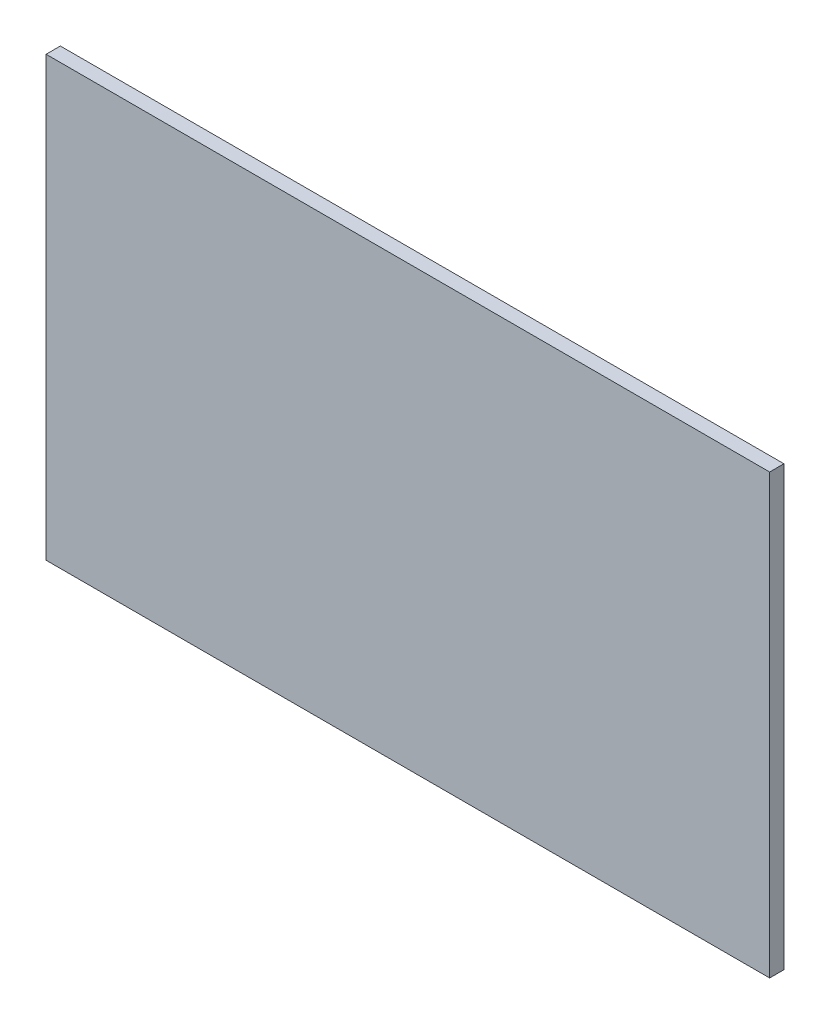
ISO-10303-21;
HEADER;
FILE_DESCRIPTION(('STEP AP214'),'2;1');
FILE_NAME('part.step','',(''),(''),'','','');
FILE_SCHEMA(('AUTOMOTIVE_DESIGN { 1 0 10303 214 1 1 1 1 }'));
ENDSEC;
DATA;
#1=APPLICATION_CONTEXT('core data for automotive mechanical design processes');
#2=APPLICATION_PROTOCOL_DEFINITION('international standard','automotive_design',2000,#1);
#3=PRODUCT_CONTEXT('',#1,'mechanical');
#4=PRODUCT('Part','Part','',(#3));
#5=PRODUCT_RELATED_PRODUCT_CATEGORY('part','',(#4));
#6=PRODUCT_DEFINITION_FORMATION('','',#4);
#7=PRODUCT_DEFINITION_CONTEXT('part definition',#1,'design');
#8=PRODUCT_DEFINITION('design','',#6,#7);
#9=PRODUCT_DEFINITION_SHAPE('','',#8);
#10=(LENGTH_UNIT() NAMED_UNIT(*) SI_UNIT(.MILLI.,.METRE.));
#11=(NAMED_UNIT(*) PLANE_ANGLE_UNIT() SI_UNIT($,.RADIAN.));
#12=(NAMED_UNIT(*) SI_UNIT($,.STERADIAN.) SOLID_ANGLE_UNIT());
#13=UNCERTAINTY_MEASURE_WITH_UNIT(LENGTH_MEASURE(1.E-05),#10,'distance_accuracy_value','');
#14=(GEOMETRIC_REPRESENTATION_CONTEXT(3) GLOBAL_UNCERTAINTY_ASSIGNED_CONTEXT((#13)) GLOBAL_UNIT_ASSIGNED_CONTEXT((#10,
#11,#12)) REPRESENTATION_CONTEXT('',''));
#15=CARTESIAN_POINT('',(0.,0.,0.));
#16=DIRECTION('',(0.,0.,1.));
#17=DIRECTION('',(1.,0.,0.));
#18=AXIS2_PLACEMENT_3D('',#15,#16,#17);
#19=CARTESIAN_POINT('',(0.,0.,7.));
#20=DIRECTION('',(1.,0.,0.));
#21=DIRECTION('',(0.,1.,0.));
#22=AXIS2_PLACEMENT_3D('',#19,#20,#21);
#23=PLANE('',#22);
#24=DIRECTION('',(0.,-1.,0.));
#25=VECTOR('',#24,1.);
#26=CARTESIAN_POINT('',(0.,0.,0.));
#27=LINE('',#26,#25);
#28=CARTESIAN_POINT('',(0.,0.,0.));
#29=VERTEX_POINT('',#28);
#30=CARTESIAN_POINT('',(0.,-215.,0.));
#31=VERTEX_POINT('',#30);
#32=EDGE_CURVE('E131',#29,#31,#27,.T.);
#33=ORIENTED_EDGE('',*,*,#32,.T.);
#34=DIRECTION('',(0.,0.,-1.));
#35=VECTOR('',#34,1.);
#36=CARTESIAN_POINT('',(0.,-215.,7.));
#37=LINE('',#36,#35);
#38=CARTESIAN_POINT('',(0.,-215.,7.));
#39=VERTEX_POINT('',#38);
#40=EDGE_CURVE('E157',#39,#31,#37,.T.);
#41=ORIENTED_EDGE('',*,*,#40,.F.);
#42=DIRECTION('',(0.,-1.,0.));
#43=VECTOR('',#42,1.);
#44=CARTESIAN_POINT('',(0.,0.,7.));
#45=LINE('',#44,#43);
#46=CARTESIAN_POINT('',(0.,0.,7.));
#47=VERTEX_POINT('',#46);
#48=EDGE_CURVE('E140',#47,#39,#45,.T.);
#49=ORIENTED_EDGE('',*,*,#48,.F.);
#50=DIRECTION('',(0.,0.,-1.));
#51=VECTOR('',#50,1.);
#52=CARTESIAN_POINT('',(0.,0.,7.));
#53=LINE('',#52,#51);
#54=EDGE_CURVE('E145',#47,#29,#53,.T.);
#55=ORIENTED_EDGE('',*,*,#54,.T.);
#56=EDGE_LOOP('',(#33,#41,#49,#55));
#57=FACE_BOUND('',#56,.T.);
#58=ADVANCED_FACE('F35',(#57),#23,.F.);
#59=CARTESIAN_POINT('',(355.,-215.,7.));
#60=DIRECTION('',(0.,1.,0.));
#61=DIRECTION('',(0.,0.,1.));
#62=AXIS2_PLACEMENT_3D('',#59,#60,#61);
#63=PLANE('',#62);
#64=DIRECTION('',(1.,0.,0.));
#65=VECTOR('',#64,1.);
#66=CARTESIAN_POINT('',(355.,-215.,0.));
#67=LINE('',#66,#65);
#68=CARTESIAN_POINT('',(355.,-215.,0.));
#69=VERTEX_POINT('',#68);
#70=EDGE_CURVE('E134',#31,#69,#67,.T.);
#71=ORIENTED_EDGE('',*,*,#70,.T.);
#72=DIRECTION('',(0.,0.,-1.));
#73=VECTOR('',#72,1.);
#74=CARTESIAN_POINT('',(355.,-215.,7.));
#75=LINE('',#74,#73);
#76=CARTESIAN_POINT('',(355.,-215.,7.));
#77=VERTEX_POINT('',#76);
#78=EDGE_CURVE('E154',#77,#69,#75,.T.);
#79=ORIENTED_EDGE('',*,*,#78,.F.);
#80=DIRECTION('',(1.,0.,0.));
#81=VECTOR('',#80,1.);
#82=CARTESIAN_POINT('',(355.,-215.,7.));
#83=LINE('',#82,#81);
#84=EDGE_CURVE('E87',#39,#77,#83,.T.);
#85=ORIENTED_EDGE('',*,*,#84,.F.);
#86=ORIENTED_EDGE('',*,*,#40,.T.);
#87=EDGE_LOOP('',(#71,#79,#85,#86));
#88=FACE_BOUND('',#87,.T.);
#89=ADVANCED_FACE('F182',(#88),#63,.F.);
#90=CARTESIAN_POINT('',(355.,0.,7.));
#91=DIRECTION('',(-1.,0.,0.));
#92=DIRECTION('',(0.,0.,1.));
#93=AXIS2_PLACEMENT_3D('',#90,#91,#92);
#94=PLANE('',#93);
#95=DIRECTION('',(0.,1.,0.));
#96=VECTOR('',#95,1.);
#97=CARTESIAN_POINT('',(355.,0.,0.));
#98=LINE('',#97,#96);
#99=CARTESIAN_POINT('',(355.,0.,0.));
#100=VERTEX_POINT('',#99);
#101=EDGE_CURVE('E148',#69,#100,#98,.T.);
#102=ORIENTED_EDGE('',*,*,#101,.T.);
#103=DIRECTION('',(0.,0.,-1.));
#104=VECTOR('',#103,1.);
#105=CARTESIAN_POINT('',(355.,0.,7.));
#106=LINE('',#105,#104);
#107=CARTESIAN_POINT('',(355.,0.,7.));
#108=VERTEX_POINT('',#107);
#109=EDGE_CURVE('E152',#108,#100,#106,.T.);
#110=ORIENTED_EDGE('',*,*,#109,.F.);
#111=DIRECTION('',(0.,1.,0.));
#112=VECTOR('',#111,1.);
#113=CARTESIAN_POINT('',(355.,0.,7.));
#114=LINE('',#113,#112);
#115=EDGE_CURVE('E143',#77,#108,#114,.T.);
#116=ORIENTED_EDGE('',*,*,#115,.F.);
#117=ORIENTED_EDGE('',*,*,#78,.T.);
#118=EDGE_LOOP('',(#102,#110,#116,#117));
#119=FACE_BOUND('',#118,.T.);
#120=ADVANCED_FACE('F187',(#119),#94,.F.);
#121=CARTESIAN_POINT('',(0.,0.,7.));
#122=DIRECTION('',(0.,-1.,0.));
#123=DIRECTION('',(0.,0.,-1.));
#124=AXIS2_PLACEMENT_3D('',#121,#122,#123);
#125=PLANE('',#124);
#126=DIRECTION('',(-1.,0.,0.));
#127=VECTOR('',#126,1.);
#128=CARTESIAN_POINT('',(0.,0.,0.));
#129=LINE('',#128,#127);
#130=EDGE_CURVE('E79',#100,#29,#129,.T.);
#131=ORIENTED_EDGE('',*,*,#130,.T.);
#132=ORIENTED_EDGE('',*,*,#54,.F.);
#133=DIRECTION('',(-1.,0.,0.));
#134=VECTOR('',#133,1.);
#135=CARTESIAN_POINT('',(0.,0.,7.));
#136=LINE('',#135,#134);
#137=EDGE_CURVE('E58',#108,#47,#136,.T.);
#138=ORIENTED_EDGE('',*,*,#137,.F.);
#139=ORIENTED_EDGE('',*,*,#109,.T.);
#140=EDGE_LOOP('',(#131,#132,#138,#139));
#141=FACE_BOUND('',#140,.T.);
#142=ADVANCED_FACE('F197',(#141),#125,.F.);
#143=CARTESIAN_POINT('',(0.,0.,7.));
#144=DIRECTION('',(0.,0.,-1.));
#145=DIRECTION('',(-1.,0.,0.));
#146=AXIS2_PLACEMENT_3D('',#143,#144,#145);
#147=PLANE('',#146);
#148=ORIENTED_EDGE('',*,*,#48,.T.);
#149=ORIENTED_EDGE('',*,*,#84,.T.);
#150=ORIENTED_EDGE('',*,*,#115,.T.);
#151=ORIENTED_EDGE('',*,*,#137,.T.);
#152=EDGE_LOOP('',(#148,#149,#150,#151));
#153=FACE_BOUND('',#152,.T.);
#154=ADVANCED_FACE('F179',(#153),#147,.F.);
#155=CARTESIAN_POINT('',(0.,0.,0.));
#156=DIRECTION('',(0.,0.,-1.));
#157=DIRECTION('',(-1.,0.,0.));
#158=AXIS2_PLACEMENT_3D('',#155,#156,#157);
#159=PLANE('',#158);
#160=DIRECTION('',(0.,-1.,0.));
#161=VECTOR('',#160,1.);
#162=CARTESIAN_POINT('',(247.5,-105.,0.));
#163=LINE('',#162,#161);
#164=CARTESIAN_POINT('',(247.5,-105.,0.));
#165=VERTEX_POINT('',#164);
#166=CARTESIAN_POINT('',(247.5,-175.,0.));
#167=VERTEX_POINT('',#166);
#168=EDGE_CURVE('E229',#165,#167,#163,.T.);
#169=ORIENTED_EDGE('',*,*,#168,.F.);
#170=DIRECTION('',(1.,0.,0.));
#171=VECTOR('',#170,1.);
#172=CARTESIAN_POINT('',(107.5,-105.,0.));
#173=LINE('',#172,#171);
#174=CARTESIAN_POINT('',(107.5,-105.,0.));
#175=VERTEX_POINT('',#174);
#176=EDGE_CURVE('E226',#175,#165,#173,.T.);
#177=ORIENTED_EDGE('',*,*,#176,.F.);
#178=DIRECTION('',(0.,1.,0.));
#179=VECTOR('',#178,1.);
#180=CARTESIAN_POINT('',(107.5,-175.,0.));
#181=LINE('',#180,#179);
#182=CARTESIAN_POINT('',(107.5,-175.,0.));
#183=VERTEX_POINT('',#182);
#184=EDGE_CURVE('E127',#183,#175,#181,.T.);
#185=ORIENTED_EDGE('',*,*,#184,.F.);
#186=DIRECTION('',(-1.,0.,0.));
#187=VECTOR('',#186,1.);
#188=CARTESIAN_POINT('',(177.5,-175.,0.));
#189=LINE('',#188,#187);
#190=EDGE_CURVE('E237',#167,#183,#189,.T.);
#191=ORIENTED_EDGE('',*,*,#190,.F.);
#192=EDGE_LOOP('',(#169,#177,#185,#191));
#193=FACE_BOUND('',#192,.T.);
#194=ORIENTED_EDGE('',*,*,#32,.F.);
#195=ORIENTED_EDGE('',*,*,#130,.F.);
#196=ORIENTED_EDGE('',*,*,#101,.F.);
#197=ORIENTED_EDGE('',*,*,#70,.F.);
#198=EDGE_LOOP('',(#194,#195,#196,#197));
#199=FACE_BOUND('',#198,.T.);
#200=ADVANCED_FACE('F167',(#193,#199),#159,.T.);
#201=CARTESIAN_POINT('',(0.,0.,-7.));
#202=DIRECTION('',(0.,0.,-1.));
#203=DIRECTION('',(-1.,0.,0.));
#204=AXIS2_PLACEMENT_3D('',#201,#202,#203);
#205=PLANE('',#204);
#206=CARTESIAN_POINT('',(177.5,-135.,-7.));
#207=DIRECTION('',(0.,0.,-1.));
#208=DIRECTION('',(-1.,0.,0.));
#209=AXIS2_PLACEMENT_3D('',#206,#207,#208);
#210=CIRCLE('',#209,2.99999999999999);
#211=CARTESIAN_POINT('',(174.5,-135.,-7.));
#212=VERTEX_POINT('',#211);
#213=EDGE_CURVE('E224',#212,#212,#210,.T.);
#214=ORIENTED_EDGE('',*,*,#213,.F.);
#215=EDGE_LOOP('',(#214));
#216=FACE_BOUND('',#215,.T.);
#217=DIRECTION('',(0.,1.,0.));
#218=VECTOR('',#217,1.);
#219=CARTESIAN_POINT('',(107.5,-125.,-7.));
#220=LINE('',#219,#218);
#221=CARTESIAN_POINT('',(107.5,-175.,-7.));
#222=VERTEX_POINT('',#221);
#223=CARTESIAN_POINT('',(107.5,-105.,-7.));
#224=VERTEX_POINT('',#223);
#225=EDGE_CURVE('E121',#222,#224,#220,.T.);
#226=ORIENTED_EDGE('',*,*,#225,.T.);
#227=DIRECTION('',(1.,0.,0.));
#228=VECTOR('',#227,1.);
#229=CARTESIAN_POINT('',(107.5,-105.,-7.));
#230=LINE('',#229,#228);
#231=CARTESIAN_POINT('',(247.5,-105.,-7.));
#232=VERTEX_POINT('',#231);
#233=EDGE_CURVE('E110',#224,#232,#230,.T.);
#234=ORIENTED_EDGE('',*,*,#233,.T.);
#235=DIRECTION('',(0.,-1.,0.));
#236=VECTOR('',#235,1.);
#237=CARTESIAN_POINT('',(247.5,-105.,-7.));
#238=LINE('',#237,#236);
#239=CARTESIAN_POINT('',(247.5,-175.,-7.));
#240=VERTEX_POINT('',#239);
#241=EDGE_CURVE('E120',#232,#240,#238,.T.);
#242=ORIENTED_EDGE('',*,*,#241,.T.);
#243=DIRECTION('',(-1.,0.,0.));
#244=VECTOR('',#243,1.);
#245=CARTESIAN_POINT('',(247.5,-175.,-7.));
#246=LINE('',#245,#244);
#247=EDGE_CURVE('E126',#240,#222,#246,.T.);
#248=ORIENTED_EDGE('',*,*,#247,.T.);
#249=EDGE_LOOP('',(#226,#234,#242,#248));
#250=FACE_BOUND('',#249,.T.);
#251=CARTESIAN_POINT('',(192.5,-135.,-7.));
#252=DIRECTION('',(0.,0.,-1.));
#253=DIRECTION('',(-1.,0.,0.));
#254=AXIS2_PLACEMENT_3D('',#251,#252,#253);
#255=CIRCLE('',#254,0.499999999999973);
#256=CARTESIAN_POINT('',(192.,-135.,-7.));
#257=VERTEX_POINT('',#256);
#258=EDGE_CURVE('E227',#257,#257,#255,.T.);
#259=ORIENTED_EDGE('',*,*,#258,.F.);
#260=EDGE_LOOP('',(#259));
#261=FACE_BOUND('',#260,.T.);
#262=ADVANCED_FACE('F123',(#216,#250,#261),#205,.T.);
#263=CARTESIAN_POINT('',(107.5,-105.,-7.));
#264=DIRECTION('',(0.,-1.,0.));
#265=DIRECTION('',(0.,0.,-1.));
#266=AXIS2_PLACEMENT_3D('',#263,#264,#265);
#267=PLANE('',#266);
#268=ORIENTED_EDGE('',*,*,#176,.T.);
#269=DIRECTION('',(0.,0.,1.));
#270=VECTOR('',#269,1.);
#271=CARTESIAN_POINT('',(247.5,-105.,-7.));
#272=LINE('',#271,#270);
#273=EDGE_CURVE('E117',#232,#165,#272,.T.);
#274=ORIENTED_EDGE('',*,*,#273,.F.);
#275=ORIENTED_EDGE('',*,*,#233,.F.);
#276=DIRECTION('',(0.,0.,1.));
#277=VECTOR('',#276,1.);
#278=CARTESIAN_POINT('',(107.5,-105.,-7.));
#279=LINE('',#278,#277);
#280=EDGE_CURVE('E114',#224,#175,#279,.T.);
#281=ORIENTED_EDGE('',*,*,#280,.T.);
#282=EDGE_LOOP('',(#268,#274,#275,#281));
#283=FACE_BOUND('',#282,.T.);
#284=ADVANCED_FACE('F112',(#283),#267,.F.);
#285=CARTESIAN_POINT('',(247.5,-105.,-7.));
#286=DIRECTION('',(-1.,0.,0.));
#287=DIRECTION('',(0.,0.,1.));
#288=AXIS2_PLACEMENT_3D('',#285,#286,#287);
#289=PLANE('',#288);
#290=ORIENTED_EDGE('',*,*,#168,.T.);
#291=DIRECTION('',(0.,0.,1.));
#292=VECTOR('',#291,1.);
#293=CARTESIAN_POINT('',(247.5,-175.,-7.));
#294=LINE('',#293,#292);
#295=EDGE_CURVE('E136',#240,#167,#294,.T.);
#296=ORIENTED_EDGE('',*,*,#295,.F.);
#297=ORIENTED_EDGE('',*,*,#241,.F.);
#298=ORIENTED_EDGE('',*,*,#273,.T.);
#299=EDGE_LOOP('',(#290,#296,#297,#298));
#300=FACE_BOUND('',#299,.T.);
#301=ADVANCED_FACE('F204',(#300),#289,.F.);
#302=CARTESIAN_POINT('',(177.5,-175.,-7.));
#303=DIRECTION('',(0.,1.,0.));
#304=DIRECTION('',(0.,0.,1.));
#305=AXIS2_PLACEMENT_3D('',#302,#303,#304);
#306=PLANE('',#305);
#307=ORIENTED_EDGE('',*,*,#190,.T.);
#308=DIRECTION('',(0.,0.,1.));
#309=VECTOR('',#308,1.);
#310=CARTESIAN_POINT('',(107.5,-175.,-7.));
#311=LINE('',#310,#309);
#312=EDGE_CURVE('E49',#222,#183,#311,.T.);
#313=ORIENTED_EDGE('',*,*,#312,.F.);
#314=ORIENTED_EDGE('',*,*,#247,.F.);
#315=ORIENTED_EDGE('',*,*,#295,.T.);
#316=EDGE_LOOP('',(#307,#313,#314,#315));
#317=FACE_BOUND('',#316,.T.);
#318=ADVANCED_FACE('F207',(#317),#306,.F.);
#319=CARTESIAN_POINT('',(107.5,-175.,-7.));
#320=DIRECTION('',(1.,0.,0.));
#321=DIRECTION('',(0.,0.,-1.));
#322=AXIS2_PLACEMENT_3D('',#319,#320,#321);
#323=PLANE('',#322);
#324=ORIENTED_EDGE('',*,*,#184,.T.);
#325=ORIENTED_EDGE('',*,*,#280,.F.);
#326=ORIENTED_EDGE('',*,*,#225,.F.);
#327=ORIENTED_EDGE('',*,*,#312,.T.);
#328=EDGE_LOOP('',(#324,#325,#326,#327));
#329=FACE_BOUND('',#328,.T.);
#330=ADVANCED_FACE('F129',(#329),#323,.F.);
#331=CARTESIAN_POINT('',(177.5,-135.,-7.));
#332=DIRECTION('',(0.,0.,1.));
#333=DIRECTION('',(1.,0.,0.));
#334=AXIS2_PLACEMENT_3D('',#331,#332,#333);
#335=CYLINDRICAL_SURFACE('',#334,2.99999999999999);
#336=ORIENTED_EDGE('',*,*,#213,.T.);
#337=EDGE_LOOP('',(#336));
#338=FACE_BOUND('',#337,.T.);
#339=CARTESIAN_POINT('',(177.5,-135.,0.));
#340=DIRECTION('',(0.,0.,-1.));
#341=DIRECTION('',(-1.,0.,0.));
#342=AXIS2_PLACEMENT_3D('',#339,#340,#341);
#343=CIRCLE('',#342,2.99999999999999);
#344=CARTESIAN_POINT('',(174.5,-135.,0.));
#345=VERTEX_POINT('',#344);
#346=EDGE_CURVE('E11',#345,#345,#343,.F.);
#347=ORIENTED_EDGE('',*,*,#346,.T.);
#348=EDGE_LOOP('',(#347));
#349=FACE_BOUND('',#348,.T.);
#350=ADVANCED_FACE('F173',(#338,#349),#335,.F.);
#351=CARTESIAN_POINT('',(192.5,-135.,-7.));
#352=DIRECTION('',(0.,0.,1.));
#353=DIRECTION('',(1.,0.,0.));
#354=AXIS2_PLACEMENT_3D('',#351,#352,#353);
#355=CYLINDRICAL_SURFACE('',#354,0.499999999999973);
#356=ORIENTED_EDGE('',*,*,#258,.T.);
#357=EDGE_LOOP('',(#356));
#358=FACE_BOUND('',#357,.T.);
#359=CARTESIAN_POINT('',(192.5,-135.,0.));
#360=DIRECTION('',(0.,0.,-1.));
#361=DIRECTION('',(-1.,0.,0.));
#362=AXIS2_PLACEMENT_3D('',#359,#360,#361);
#363=CIRCLE('',#362,0.499999999999973);
#364=CARTESIAN_POINT('',(192.,-135.,0.));
#365=VERTEX_POINT('',#364);
#366=EDGE_CURVE('E42',#365,#365,#363,.F.);
#367=ORIENTED_EDGE('',*,*,#366,.T.);
#368=EDGE_LOOP('',(#367));
#369=FACE_BOUND('',#368,.T.);
#370=ADVANCED_FACE('F161',(#358,#369),#355,.F.);
#371=ORIENTED_EDGE('',*,*,#366,.F.);
#372=EDGE_LOOP('',(#371));
#373=FACE_BOUND('',#372,.T.);
#374=ADVANCED_FACE('F163',(#373),#159,.T.);
#375=ORIENTED_EDGE('',*,*,#346,.F.);
#376=EDGE_LOOP('',(#375));
#377=FACE_BOUND('',#376,.T.);
#378=ADVANCED_FACE('F165',(#377),#159,.T.);
#379=CLOSED_SHELL('',(#58,#89,#120,#142,#154,#200,#262,#284,#301,#318,#330,#350,#370,#374,#378));
#380=MANIFOLD_SOLID_BREP('B2',#379);
#381=ADVANCED_BREP_SHAPE_REPRESENTATION('',(#18,#380),#14);
#382=SHAPE_DEFINITION_REPRESENTATION(#9,#381);
ENDSEC;
END-ISO-10303-21;
